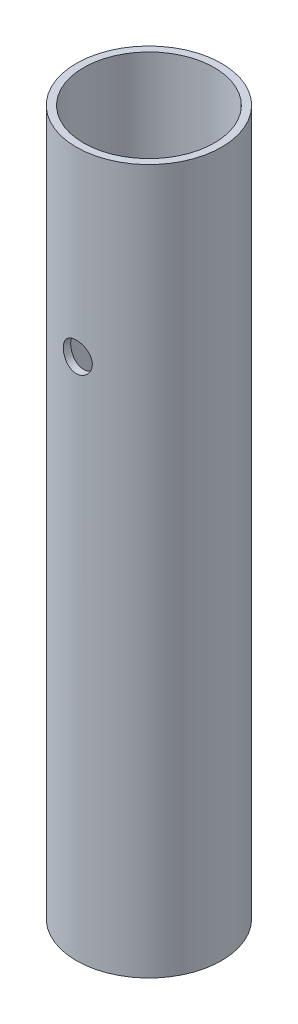
ISO-10303-21;
HEADER;
FILE_DESCRIPTION(('STEP AP214'),'2;1');
FILE_NAME('part.step','',(''),(''),'','','');
FILE_SCHEMA(('AUTOMOTIVE_DESIGN { 1 0 10303 214 1 1 1 1 }'));
ENDSEC;
DATA;
#1=APPLICATION_CONTEXT('core data for automotive mechanical design processes');
#2=APPLICATION_PROTOCOL_DEFINITION('international standard','automotive_design',2000,#1);
#3=PRODUCT_CONTEXT('',#1,'mechanical');
#4=PRODUCT('Part','Part','',(#3));
#5=PRODUCT_RELATED_PRODUCT_CATEGORY('part','',(#4));
#6=PRODUCT_DEFINITION_FORMATION('','',#4);
#7=PRODUCT_DEFINITION_CONTEXT('part definition',#1,'design');
#8=PRODUCT_DEFINITION('design','',#6,#7);
#9=PRODUCT_DEFINITION_SHAPE('','',#8);
#10=(LENGTH_UNIT() NAMED_UNIT(*) SI_UNIT(.MILLI.,.METRE.));
#11=(NAMED_UNIT(*) PLANE_ANGLE_UNIT() SI_UNIT($,.RADIAN.));
#12=(NAMED_UNIT(*) SI_UNIT($,.STERADIAN.) SOLID_ANGLE_UNIT());
#13=UNCERTAINTY_MEASURE_WITH_UNIT(LENGTH_MEASURE(1.E-05),#10,'distance_accuracy_value','');
#14=(GEOMETRIC_REPRESENTATION_CONTEXT(3) GLOBAL_UNCERTAINTY_ASSIGNED_CONTEXT((#13)) GLOBAL_UNIT_ASSIGNED_CONTEXT((#10,
#11,#12)) REPRESENTATION_CONTEXT('',''));
#15=CARTESIAN_POINT('',(0.,0.,0.));
#16=DIRECTION('',(0.,0.,1.));
#17=DIRECTION('',(1.,0.,0.));
#18=AXIS2_PLACEMENT_3D('',#15,#16,#17);
#19=CARTESIAN_POINT('',(0.,307.975,0.));
#20=DIRECTION('',(0.,1.,0.));
#21=DIRECTION('',(0.,0.,1.));
#22=AXIS2_PLACEMENT_3D('',#19,#20,#21);
#23=PLANE('',#22);
#24=CARTESIAN_POINT('',(0.,307.975,0.));
#25=DIRECTION('',(0.,1.,0.));
#26=DIRECTION('',(0.,0.,1.));
#27=AXIS2_PLACEMENT_3D('',#24,#25,#26);
#28=CIRCLE('',#27,31.75);
#29=CARTESIAN_POINT('',(0.,307.975,31.75));
#30=VERTEX_POINT('',#29);
#31=EDGE_CURVE('E10',#30,#30,#28,.T.);
#32=ORIENTED_EDGE('',*,*,#31,.T.);
#33=EDGE_LOOP('',(#32));
#34=FACE_BOUND('',#33,.T.);
#35=CARTESIAN_POINT('',(0.,307.975,0.));
#36=DIRECTION('',(0.,1.,0.));
#37=DIRECTION('',(0.,0.,1.));
#38=AXIS2_PLACEMENT_3D('',#35,#36,#37);
#39=CIRCLE('',#38,28.575);
#40=CARTESIAN_POINT('',(0.,307.975,28.575));
#41=VERTEX_POINT('',#40);
#42=EDGE_CURVE('E64',#41,#41,#39,.T.);
#43=ORIENTED_EDGE('',*,*,#42,.F.);
#44=EDGE_LOOP('',(#43));
#45=FACE_BOUND('',#44,.T.);
#46=ADVANCED_FACE('F43',(#34,#45),#23,.T.);
#47=CARTESIAN_POINT('',(0.,0.,0.));
#48=DIRECTION('',(0.,1.,0.));
#49=DIRECTION('',(0.,0.,1.));
#50=AXIS2_PLACEMENT_3D('',#47,#48,#49);
#51=PLANE('',#50);
#52=CARTESIAN_POINT('',(0.,0.,0.));
#53=DIRECTION('',(0.,1.,0.));
#54=DIRECTION('',(0.,0.,1.));
#55=AXIS2_PLACEMENT_3D('',#52,#53,#54);
#56=CIRCLE('',#55,31.75);
#57=CARTESIAN_POINT('',(0.,0.,31.75));
#58=VERTEX_POINT('',#57);
#59=EDGE_CURVE('E58',#58,#58,#56,.T.);
#60=ORIENTED_EDGE('',*,*,#59,.F.);
#61=EDGE_LOOP('',(#60));
#62=FACE_BOUND('',#61,.T.);
#63=CARTESIAN_POINT('',(0.,0.,0.));
#64=DIRECTION('',(0.,1.,0.));
#65=DIRECTION('',(0.,0.,1.));
#66=AXIS2_PLACEMENT_3D('',#63,#64,#65);
#67=CIRCLE('',#66,28.575);
#68=CARTESIAN_POINT('',(0.,0.,28.575));
#69=VERTEX_POINT('',#68);
#70=EDGE_CURVE('E67',#69,#69,#67,.T.);
#71=ORIENTED_EDGE('',*,*,#70,.T.);
#72=EDGE_LOOP('',(#71));
#73=FACE_BOUND('',#72,.T.);
#74=ADVANCED_FACE('F108',(#62,#73),#51,.F.);
#75=CARTESIAN_POINT('',(0.,307.975,0.));
#76=DIRECTION('',(0.,-1.,0.));
#77=DIRECTION('',(0.,0.,-1.));
#78=AXIS2_PLACEMENT_3D('',#75,#76,#77);
#79=CYLINDRICAL_SURFACE('',#78,31.75);
#80=CARTESIAN_POINT('',(0.,234.95,-31.75));
#81=CARTESIAN_POINT('',(-0.176515873629844,234.950003517111,-31.750001786253));
#82=CARTESIAN_POINT('',(-0.352987697070184,234.942637979714,-31.7485254277497));
#83=CARTESIAN_POINT('',(-0.704709806033701,234.913241127896,-31.7426651106269));
#84=CARTESIAN_POINT('',(-0.879959880354004,234.891207338342,-31.7382806612941));
#85=CARTESIAN_POINT('',(-1.22801018212194,234.832628425191,-31.7267212079851));
#86=CARTESIAN_POINT('',(-1.40080909558926,234.796075802001,-31.7195447618636));
#87=CARTESIAN_POINT('',(-1.74270808478486,234.708732190791,-31.7025988453969));
#88=CARTESIAN_POINT('',(-1.91180677638476,234.657935969655,-31.6928284220916));
#89=CARTESIAN_POINT('',(-2.24483065595256,234.542579240468,-31.6709811642523));
#90=CARTESIAN_POINT('',(-2.40876248514714,234.478037304188,-31.6589074439642));
#91=CARTESIAN_POINT('',(-2.73062697231968,234.335604502278,-31.6327719144705));
#92=CARTESIAN_POINT('',(-2.88855739174261,234.257708714161,-31.6187093724827));
#93=CARTESIAN_POINT('',(-3.19722223110234,234.089187104317,-31.5889902090418));
#94=CARTESIAN_POINT('',(-3.34795983411256,233.998566984883,-31.5733343025006));
#95=CARTESIAN_POINT('',(-3.64136966101498,233.805171658321,-31.5408421811988));
#96=CARTESIAN_POINT('',(-3.78403884447123,233.70239191358,-31.5240055267784));
#97=CARTESIAN_POINT('',(-4.06194074003547,233.484129433893,-31.4894105615738));
#98=CARTESIAN_POINT('',(-4.19706617045533,233.368511432613,-31.4716437358091));
#99=CARTESIAN_POINT('',(-4.45717927487416,233.126327768617,-31.435860075574));
#100=CARTESIAN_POINT('',(-4.58216317367903,232.999758065019,-31.4178431509003));
#101=CARTESIAN_POINT('',(-4.82105872090809,232.736600526564,-31.3820725979793));
#102=CARTESIAN_POINT('',(-4.93497355191153,232.600015591222,-31.3643188953019));
#103=CARTESIAN_POINT('',(-5.15103007395078,232.31766092856,-31.329560637437));
#104=CARTESIAN_POINT('',(-5.25316740714552,232.171887832149,-31.3125563609763));
#105=CARTESIAN_POINT('',(-5.44574317482543,231.870868536502,-31.2796421399617));
#106=CARTESIAN_POINT('',(-5.53607140132951,231.715550596702,-31.2637430750476));
#107=CARTESIAN_POINT('',(-5.70333527117827,231.397632781188,-31.2336627723482));
#108=CARTESIAN_POINT('',(-5.78026589012988,231.235030202192,-31.219482179631));
#109=CARTESIAN_POINT('',(-5.92007801871017,230.903790754845,-31.1932725472161));
#110=CARTESIAN_POINT('',(-5.98296581237376,230.73515662491,-31.1812425456312));
#111=CARTESIAN_POINT('',(-6.09426120308402,230.393022046669,-31.1596797091957));
#112=CARTESIAN_POINT('',(-6.1426635469331,230.219519857834,-31.1501477804351));
#113=CARTESIAN_POINT('',(-6.26436580052017,229.698175631637,-31.1259929027572));
#114=CARTESIAN_POINT('',(-6.31616350912265,229.34473348736,-31.1154218279837));
#115=CARTESIAN_POINT('',(-6.34895807298002,228.812286108104,-31.1087311881774));
#116=CARTESIAN_POINT('',(-6.35239822671563,228.634350550376,-31.1080302095165));
#117=CARTESIAN_POINT('',(-6.34436208508678,228.278808755367,-31.1096704679197));
#118=CARTESIAN_POINT('',(-6.33288556196145,228.101202523158,-31.1120117514355));
#119=CARTESIAN_POINT('',(-6.27668994676439,227.576280872722,-31.123422384838));
#120=CARTESIAN_POINT('',(-6.2105456438322,227.23111113521,-31.1368107003154));
#121=CARTESIAN_POINT('',(-6.02257965402933,226.557049849712,-31.1737072373072));
#122=CARTESIAN_POINT('',(-5.90075530818731,226.22815907995,-31.1972159421125));
#123=CARTESIAN_POINT('',(-5.60403262349579,225.593192448002,-31.2518821655055));
#124=CARTESIAN_POINT('',(-5.42878112659535,225.287285814923,-31.2830903079339));
#125=CARTESIAN_POINT('',(-5.03042913225744,224.708901252043,-31.3496081873137));
#126=CARTESIAN_POINT('',(-4.80732313575254,224.436427169713,-31.3849183954287));
#127=CARTESIAN_POINT('',(-4.31482460269526,223.927484353394,-31.4564408776495));
#128=CARTESIAN_POINT('',(-4.04467162861224,223.691751477766,-31.4926579526169));
#129=CARTESIAN_POINT('',(-3.46827489788048,223.268832792312,-31.5613318856404));
#130=CARTESIAN_POINT('',(-3.16203067844189,223.0816476051,-31.5937886954689));
#131=CARTESIAN_POINT('',(-2.52132710810059,222.761000392218,-31.6513648273005));
#132=CARTESIAN_POINT('',(-2.18682455512024,222.627622494247,-31.6764726424597));
#133=CARTESIAN_POINT('',(-1.49954599969551,222.419160970968,-31.7164344701347));
#134=CARTESIAN_POINT('',(-1.14677221636532,222.344070284073,-31.7312897247402));
#135=CARTESIAN_POINT('',(-0.439289227300463,222.25535651817,-31.7488996638347));
#136=CARTESIAN_POINT('',(-0.0847110903586681,222.24072631672,-31.751852591002));
#137=CARTESIAN_POINT('',(0.621823337614687,222.270636623481,-31.7458757969914));
#138=CARTESIAN_POINT('',(0.973779774913396,222.315173805444,-31.73694674379));
#139=CARTESIAN_POINT('',(1.66183092044862,222.461317596138,-31.7083333344831));
#140=CARTESIAN_POINT('',(1.99803979686685,222.562407451715,-31.6887464089675));
#141=CARTESIAN_POINT('',(2.64873510972006,222.818223573132,-31.6410055485747));
#142=CARTESIAN_POINT('',(2.96321991658336,222.972953857434,-31.6128509718729));
#143=CARTESIAN_POINT('',(3.56578616929235,223.333832745457,-31.5506044099281));
#144=CARTESIAN_POINT('',(3.85349724041879,223.540587642923,-31.5164439562024));
#145=CARTESIAN_POINT('',(4.39050548597875,223.998852381271,-31.4461355582368));
#146=CARTESIAN_POINT('',(4.6397985365499,224.250367020513,-31.4099874011973));
#147=CARTESIAN_POINT('',(5.0967637160485,224.795530557235,-31.339111168045));
#148=CARTESIAN_POINT('',(5.30374424342026,225.089762743337,-31.3044130988342));
#149=CARTESIAN_POINT('',(5.66539258384694,225.709609374793,-31.240994705098));
#150=CARTESIAN_POINT('',(5.82006248993914,226.035222563871,-31.2122741414201));
#151=CARTESIAN_POINT('',(6.00888128728986,226.538943791457,-31.1762701460107));
#152=CARTESIAN_POINT('',(6.06455145769408,226.709028961714,-31.1654635742738));
#153=CARTESIAN_POINT('',(6.16137084827379,227.053410302793,-31.1464680580441));
#154=CARTESIAN_POINT('',(6.20252539551952,227.227704903658,-31.1382781533681));
#155=CARTESIAN_POINT('',(6.26997942157555,227.579258617162,-31.1247656494108));
#156=CARTESIAN_POINT('',(6.2962776417427,227.756517979669,-31.1194432930729));
#157=CARTESIAN_POINT('',(6.33380495629898,228.112687683411,-31.1118270906216));
#158=CARTESIAN_POINT('',(6.34503461133419,228.291597962972,-31.1095331318328));
#159=CARTESIAN_POINT('',(6.35226474660965,228.646487038422,-31.1080575406869));
#160=CARTESIAN_POINT('',(6.34853785693816,228.822460122926,-31.1088201916633));
#161=CARTESIAN_POINT('',(6.32649775022552,229.173449644059,-31.113309893758));
#162=CARTESIAN_POINT('',(6.30818480904806,229.348466098718,-31.1170368888122));
#163=CARTESIAN_POINT('',(6.25711483230155,229.696322486522,-31.1273463511437));
#164=CARTESIAN_POINT('',(6.22435534563776,229.8691620452,-31.1339293029782));
#165=CARTESIAN_POINT('',(6.14466408954099,230.21135148816,-31.1497552236973));
#166=CARTESIAN_POINT('',(6.09773737625182,230.38070259444,-31.1589972435314));
#167=CARTESIAN_POINT('',(5.99018114767237,230.714451560489,-31.179852808307));
#168=CARTESIAN_POINT('',(5.92958046510072,230.878859029406,-31.1914613583189));
#169=CARTESIAN_POINT('',(5.79509639810806,231.201914726542,-31.2167268260793));
#170=CARTESIAN_POINT('',(5.72121771328373,231.360564968664,-31.2303830188056));
#171=CARTESIAN_POINT('',(5.56066227689416,231.67117438533,-31.2593696133703));
#172=CARTESIAN_POINT('',(5.47398021455167,231.823130749167,-31.2747007092597));
#173=CARTESIAN_POINT('',(5.28847941073908,232.119232546957,-31.3066021121074));
#174=CARTESIAN_POINT('',(5.18966483440073,232.263380637161,-31.3231719930268));
#175=CARTESIAN_POINT('',(4.97872853035759,232.545415952405,-31.3573974014845));
#176=CARTESIAN_POINT('',(4.86640554222483,232.683151015046,-31.3750667836359));
#177=CARTESIAN_POINT('',(4.63068014708206,232.948655636753,-31.4107227185785));
#178=CARTESIAN_POINT('',(4.50728164590522,233.076428679501,-31.4287091577737));
#179=CARTESIAN_POINT('',(4.25012766356565,233.321276588489,-31.464516090974));
#180=CARTESIAN_POINT('',(4.11636609340417,233.438345075658,-31.4823364804191));
#181=CARTESIAN_POINT('',(3.83949929192401,233.660857214147,-31.517300073905));
#182=CARTESIAN_POINT('',(3.69639751718187,233.766305127546,-31.5344435247363));
#183=CARTESIAN_POINT('',(3.40016257824087,233.965970908534,-31.5677659237014));
#184=CARTESIAN_POINT('',(3.24693728557459,234.060054254477,-31.5839323628997));
#185=CARTESIAN_POINT('',(2.93299471924431,234.23491940113,-31.6146312316985));
#186=CARTESIAN_POINT('',(2.77228023354734,234.315706101758,-31.629164262594));
#187=CARTESIAN_POINT('',(2.44452562453279,234.463367119417,-31.6561810934558));
#188=CARTESIAN_POINT('',(2.27748939904036,234.530249849272,-31.6686661316228));
#189=CARTESIAN_POINT('',(1.93825421946105,234.649629354515,-31.6912384274328));
#190=CARTESIAN_POINT('',(1.76605626709905,234.702128901418,-31.7013261469685));
#191=CARTESIAN_POINT('',(1.33248673917251,234.814393371527,-31.7230870847536));
#192=CARTESIAN_POINT('',(1.06865101743696,234.865176459559,-31.7331270216992));
#193=CARTESIAN_POINT('',(0.53650953612495,234.932976563711,-31.7465820167065));
#194=CARTESIAN_POINT('',(0.268203919287763,234.949994655988,-31.7499972859095));
#195=CARTESIAN_POINT('',(0.,234.95,-31.75));
#196=B_SPLINE_CURVE_WITH_KNOTS('',3,(#80,#81,#82,#83,#84,#85,#86,#87,#88,#89,#90,#91,#92,#93,
#94,#95,#96,#97,#98,#99,#100,#101,#102,#103,#104,#105,#106,#107,#108,#109,#110,#111,#112,#113,
#114,#115,#116,#117,#118,#119,#120,#121,#122,#123,#124,#125,#126,#127,#128,#129,#130,#131,#132,
#133,#134,#135,#136,#137,#138,#139,#140,#141,#142,#143,#144,#145,#146,#147,#148,#149,#150,#151,
#152,#153,#154,#155,#156,#157,#158,#159,#160,#161,#162,#163,#164,#165,#166,#167,#168,#169,#170,
#171,#172,#173,#174,#175,#176,#177,#178,#179,#180,#181,#182,#183,#184,#185,#186,#187,#188,#189,
#190,#191,#192,#193,#194,#195),.UNSPECIFIED.,.T.,.F.,(4,2,2,2,2,2,2,2,2,2,2,2,2,2,2,2,2,2,2,2,2,
2,2,2,2,2,2,2,2,2,2,2,2,2,2,2,2,2,2,2,2,2,2,2,2,2,2,2,2,2,2,2,2,2,2,2,2,4),(0.,
0.529312114039987,1.05871356728208,1.58838883517267,2.11825896195246,2.64741767457623,
3.17677186635166,3.70588958555339,4.23520538238133,4.77075073798215,5.30649454487121,
5.84208385602022,6.37787071116718,6.91834660422096,7.45902475299785,7.99946046625028,
8.54009193351099,9.60600520292841,10.1393933239035,10.672789589211,11.7225222322519,
12.772305009965,13.8291831952813,14.8861828939573,15.9621966005539,17.0382241061318,
18.1159275205837,19.1935003491785,20.253049282796,21.3125386536278,22.3625013932241,
23.4125428075706,24.4754392604714,25.5384497273197,26.617647482134,27.6968020512933,
28.2341330538773,28.7712666563531,29.3084457585129,29.8456048736531,30.3730174550141,
30.9004200617414,31.4279121854685,31.9552162745463,32.4814187198833,33.0074352873591,
33.5336706598291,34.0597258764733,34.5949149025681,35.1299159277244,35.665233721342,
36.2003545183118,36.7412917478686,37.2820291893049,37.8224384903497,38.3627435858253,
39.1670231413712,39.9712770625212),.UNSPECIFIED.);
#197=CARTESIAN_POINT('',(0.,234.95,-31.75));
#198=VERTEX_POINT('',#197);
#199=EDGE_CURVE('E94',#198,#198,#196,.T.);
#200=ORIENTED_EDGE('',*,*,#199,.T.);
#201=EDGE_LOOP('',(#200));
#202=FACE_BOUND('',#201,.T.);
#203=CARTESIAN_POINT('',(6.35,228.6,31.1085197333464));
#204=CARTESIAN_POINT('',(6.35000352965397,228.42352383559,31.1085178108911));
#205=CARTESIAN_POINT('',(6.34264126953907,228.247091736493,31.110024226625));
#206=CARTESIAN_POINT('',(6.31325784324557,227.895450159614,31.1160010172917));
#207=CARTESIAN_POINT('',(6.29123419873982,227.720240893598,31.1204718933298));
#208=CARTESIAN_POINT('',(6.23268302188221,227.372273052546,31.1322509181554));
#209=CARTESIAN_POINT('',(6.19614792837602,227.199515803809,31.1395605460233));
#210=CARTESIAN_POINT('',(6.10884756830871,226.85770106187,31.1568044027474));
#211=CARTESIAN_POINT('',(6.05807706364932,226.688644955281,31.1667395976364));
#212=CARTESIAN_POINT('',(5.94278242475048,226.355711701628,31.1889287217452));
#213=CARTESIAN_POINT('',(5.87827737527494,226.191827726813,31.2011794308286));
#214=CARTESIAN_POINT('',(5.73592730042869,225.870054937498,31.2276620589226));
#215=CARTESIAN_POINT('',(5.65807735407483,225.712168360893,31.2418947084169));
#216=CARTESIAN_POINT('',(5.48965449210837,225.403583559738,31.2719283606296));
#217=CARTESIAN_POINT('',(5.39908723222125,225.252882179436,31.2877286652587));
#218=CARTESIAN_POINT('',(5.20580256304731,224.959535088672,31.3204681817267));
#219=CARTESIAN_POINT('',(5.10308061702835,224.816892415656,31.337407817796));
#220=CARTESIAN_POINT('',(4.88487647886519,224.538955767765,31.3721665291629));
#221=CARTESIAN_POINT('',(4.7692526430892,224.403774010068,31.3899938693132));
#222=CARTESIAN_POINT('',(4.52704538325729,224.143547617887,31.4258388721703));
#223=CARTESIAN_POINT('',(4.40045791318251,224.018506759046,31.4438566029667));
#224=CARTESIAN_POINT('',(4.1372534632526,223.779499598338,31.4795689594845));
#225=CARTESIAN_POINT('',(4.00063945933364,223.665530033593,31.4972636791461));
#226=CARTESIAN_POINT('',(3.71821533757456,223.449368051746,31.5318508682276));
#227=CARTESIAN_POINT('',(3.57240184945219,223.347179990084,31.5487430396095));
#228=CARTESIAN_POINT('',(3.27134927808729,223.154545725515,31.5813850448061));
#229=CARTESIAN_POINT('',(3.1160415103462,223.064204975405,31.5971241323102));
#230=CARTESIAN_POINT('',(2.79814283643944,222.89691503045,31.6268620084164));
#231=CARTESIAN_POINT('',(2.63554922691931,222.819970858908,31.6408601436557));
#232=CARTESIAN_POINT('',(2.30432798182607,222.680131141841,31.6667034900586));
#233=CARTESIAN_POINT('',(2.13570305797417,222.617229372627,31.6785496545553));
#234=CARTESIAN_POINT('',(1.79358912840508,222.505905844958,31.6997641681565));
#235=CARTESIAN_POINT('',(1.62009838125299,222.457489344888,31.7091316173057));
#236=CARTESIAN_POINT('',(1.09881790139745,222.335749209317,31.7328561059012));
#237=CARTESIAN_POINT('',(0.745434289901047,222.283922207883,31.7432198335018));
#238=CARTESIAN_POINT('',(0.213073296878946,222.251069094988,31.7497873225853));
#239=CARTESIAN_POINT('',(0.035165964123797,222.247607014947,31.7504785894235));
#240=CARTESIAN_POINT('',(-0.320322123483623,222.255594728642,31.7488811393463));
#241=CARTESIAN_POINT('',(-0.497902873110932,222.267044758912,31.746592375162));
#242=CARTESIAN_POINT('',(-1.02305381244427,222.323187755784,31.7354178724373));
#243=CARTESIAN_POINT('',(-1.3684812734637,222.389349670036,31.7222872253983));
#244=CARTESIAN_POINT('',(-2.04304886823863,222.577438891131,31.6860045205057));
#245=CARTESIAN_POINT('',(-2.37218834973945,222.699368429198,31.6628520616883));
#246=CARTESIAN_POINT('',(-3.00746924755296,222.996315502072,31.6088579535731));
#247=CARTESIAN_POINT('',(-3.31345265993525,223.171662751717,31.5779687669697));
#248=CARTESIAN_POINT('',(-3.89195088746714,223.570222708259,31.511904903753));
#249=CARTESIAN_POINT('',(-4.16446184582488,223.793440922866,31.476729734225));
#250=CARTESIAN_POINT('',(-4.6732905302415,224.286023481747,31.4052562117905));
#251=CARTESIAN_POINT('',(-4.90889462711121,224.556124330706,31.3689489681662));
#252=CARTESIAN_POINT('',(-5.33157771480941,225.132369414589,31.2998848034075));
#253=CARTESIAN_POINT('',(-5.51865578784077,225.438514331074,31.2671279494303));
#254=CARTESIAN_POINT('',(-5.83922379826299,226.079182280604,31.2088560123341));
#255=CARTESIAN_POINT('',(-5.97259819449291,226.413764643687,31.1833565774064));
#256=CARTESIAN_POINT('',(-6.18102868817351,227.101217906344,31.1427162458207));
#257=CARTESIAN_POINT('',(-6.25609238629833,227.454086415958,31.1275739991561));
#258=CARTESIAN_POINT('',(-6.34470413857638,228.161626846748,31.1096329331129));
#259=CARTESIAN_POINT('',(-6.35928282318092,228.516164591404,31.1066273360059));
#260=CARTESIAN_POINT('',(-6.32928392059337,229.222606222812,31.1127448401072));
#261=CARTESIAN_POINT('',(-6.28470968786131,229.57451025778,31.1218672535569));
#262=CARTESIAN_POINT('',(-6.13855909700573,230.262230845667,31.1510192618596));
#263=CARTESIAN_POINT('',(-6.03753342500046,230.598169303318,31.1709434300677));
#264=CARTESIAN_POINT('',(-5.78193529151485,231.248351896797,31.2193615811841));
#265=CARTESIAN_POINT('',(-5.62735841899352,231.562594242947,31.2478562700252));
#266=CARTESIAN_POINT('',(-5.26671737189738,232.164972964857,31.3106692503795));
#267=CARTESIAN_POINT('',(-5.06000835825492,232.452715680252,31.3450586073921));
#268=CARTESIAN_POINT('',(-4.60181287007307,232.989808845073,31.4155915690316));
#269=CARTESIAN_POINT('',(-4.35032178697911,233.239155338188,31.451735353929));
#270=CARTESIAN_POINT('',(-3.80514015244604,233.696268217544,31.5223740606501));
#271=CARTESIAN_POINT('',(-3.51086106064981,233.903337546841,31.5568351532982));
#272=CARTESIAN_POINT('',(-2.89089395358626,234.265141507072,31.6196441155571));
#273=CARTESIAN_POINT('',(-2.5652072580855,234.41987833582,31.6479922418764));
#274=CARTESIAN_POINT('',(-2.06145931814501,234.608741663909,31.6834545251939));
#275=CARTESIAN_POINT('',(-1.89142419678391,234.664408664306,31.6940818842471));
#276=CARTESIAN_POINT('',(-1.54714780275177,234.761229259573,31.7127491568066));
#277=CARTESIAN_POINT('',(-1.37290809541261,234.802388169265,31.720790017743));
#278=CARTESIAN_POINT('',(-1.02146662350878,234.869859812117,31.7340519544925));
#279=CARTESIAN_POINT('',(-0.844264584786209,234.896171163245,31.7392727678096));
#280=CARTESIAN_POINT('',(-0.48821090793864,234.933734183265,31.7467454492913));
#281=CARTESIAN_POINT('',(-0.309359330073799,234.944986400113,31.7489974254827));
#282=CARTESIAN_POINT('',(0.0455478764120614,234.952273663548,31.7504546434394));
#283=CARTESIAN_POINT('',(0.221597991326798,234.948570143226,31.7497122287987));
#284=CARTESIAN_POINT('',(0.572744112386659,234.926563805665,31.7453192352643));
#285=CARTESIAN_POINT('',(0.747840136517743,234.908261264604,31.7416687113849));
#286=CARTESIAN_POINT('',(1.09585752140951,234.857198494089,31.7315601252889));
#287=CARTESIAN_POINT('',(1.26877851579409,234.824435861558,31.7251015964213));
#288=CARTESIAN_POINT('',(1.61113197945253,234.744723994435,31.7095586102968));
#289=CARTESIAN_POINT('',(1.78056567274322,234.697779831389,31.7004750918291));
#290=CARTESIAN_POINT('',(2.11450386521707,234.59016595803,31.6799511720231));
#291=CARTESIAN_POINT('',(2.27901728275358,234.529523030463,31.6685153735272));
#292=CARTESIAN_POINT('',(2.60227862901699,234.394936454954,31.6435920801276));
#293=CARTESIAN_POINT('',(2.76102857721267,234.320997520944,31.63010531263));
#294=CARTESIAN_POINT('',(3.07182664827637,234.160305591911,31.6014358670824));
#295=CARTESIAN_POINT('',(3.22387198234193,234.073547328731,31.5862524924329));
#296=CARTESIAN_POINT('',(3.52013767812032,233.887880722534,31.5546085541198));
#297=CARTESIAN_POINT('',(3.66436070621944,233.788976557688,31.5381484303699));
#298=CARTESIAN_POINT('',(3.94640998656119,233.577939284948,31.5041086276047));
#299=CARTESIAN_POINT('',(4.0840913833523,233.465614786915,31.4865149549271));
#300=CARTESIAN_POINT('',(4.34948710126135,233.229897518759,31.4509520575298));
#301=CARTESIAN_POINT('',(4.4772049066996,233.106508650644,31.4329829669079));
#302=CARTESIAN_POINT('',(4.72194312383746,232.849385108589,31.3971505322712));
#303=CARTESIAN_POINT('',(4.83895709176201,232.715644290984,31.3792872579311));
#304=CARTESIAN_POINT('',(5.06136278678991,232.438830318081,31.3441825624069));
#305=CARTESIAN_POINT('',(5.16675876618455,232.295760607963,31.3269409152667));
#306=CARTESIAN_POINT('',(5.36635585799919,231.999554762855,31.2933712660395));
#307=CARTESIAN_POINT('',(5.46041869766267,231.846323998045,31.2770556278699));
#308=CARTESIAN_POINT('',(5.63524258374716,231.53237333481,31.2460305142114));
#309=CARTESIAN_POINT('',(5.71600853022447,231.371656223325,31.2313204477275));
#310=CARTESIAN_POINT('',(5.86362866048357,231.043897683308,31.2039420449014));
#311=CARTESIAN_POINT('',(5.93049132287948,230.876860183028,31.191272465282));
#312=CARTESIAN_POINT('',(6.04983198149677,230.537621222421,31.1683447042479));
#313=CARTESIAN_POINT('',(6.10231276076966,230.365420768347,31.1580860563464));
#314=CARTESIAN_POINT('',(6.2145026469957,229.931953535648,31.1359475624671));
#315=CARTESIAN_POINT('',(6.26524447776627,229.66822500119,31.1257189811481));
#316=CARTESIAN_POINT('',(6.33298989163512,229.136296975648,31.1120066431205));
#317=CARTESIAN_POINT('',(6.34999463784868,228.868097639021,31.1085226538864));
#318=CARTESIAN_POINT('',(6.35,228.6,31.1085197333464));
#319=B_SPLINE_CURVE_WITH_KNOTS('',3,(#203,#204,#205,#206,#207,#208,#209,#210,#211,#212,#213,
#214,#215,#216,#217,#218,#219,#220,#221,#222,#223,#224,#225,#226,#227,#228,#229,#230,#231,#232,
#233,#234,#235,#236,#237,#238,#239,#240,#241,#242,#243,#244,#245,#246,#247,#248,#249,#250,#251,
#252,#253,#254,#255,#256,#257,#258,#259,#260,#261,#262,#263,#264,#265,#266,#267,#268,#269,#270,
#271,#272,#273,#274,#275,#276,#277,#278,#279,#280,#281,#282,#283,#284,#285,#286,#287,#288,#289,
#290,#291,#292,#293,#294,#295,#296,#297,#298,#299,#300,#301,#302,#303,#304,#305,#306,#307,#308,
#309,#310,#311,#312,#313,#314,#315,#316,#317,#318),.UNSPECIFIED.,.T.,.F.,(4,2,2,2,2,2,2,2,2,2,2,
2,2,2,2,2,2,2,2,2,2,2,2,2,2,2,2,2,2,2,2,2,2,2,2,2,2,2,2,2,2,2,2,2,2,2,2,2,2,2,2,2,2,2,2,2,2,4),
(0.,0.529192824017304,1.05847512431125,1.58803356836858,2.11778712640188,2.64680931691147,
3.17602700774436,3.70501008253467,4.23419122660465,4.76989337143009,5.30579406105337,
5.84153633037384,6.37747602457235,6.91790211014691,7.45853040439669,7.99891861063168,
8.53950274902681,9.60524741944587,10.1385532375566,10.6718675149982,11.722333887346,
12.7728422917995,13.8299709337326,14.8872212670156,15.9628992650341,17.0385976064091,
18.1165980571035,19.1944579691676,20.2538743662693,21.3132306882596,22.3624289489456,
23.4117136532091,24.4746750413869,25.5377458829631,26.6171359557789,27.6964806917164,
28.2336350375249,28.7705923999337,29.307599734856,29.8445875291854,30.3722295246526,
30.8998615386703,31.4275812712333,31.9551125056042,32.4816211446926,33.0079434834282,
33.5344827211633,34.0608413348825,34.5958869383104,35.1307445868251,35.6659221325256,
36.2009031433033,36.7418628907065,37.2826228399026,37.82305204501,38.3633765971959,
39.1673392099915,39.9712741049963),.UNSPECIFIED.);
#320=CARTESIAN_POINT('',(6.35,228.6,31.1085197333464));
#321=VERTEX_POINT('',#320);
#322=EDGE_CURVE('E88',#321,#321,#319,.T.);
#323=ORIENTED_EDGE('',*,*,#322,.T.);
#324=EDGE_LOOP('',(#323));
#325=FACE_BOUND('',#324,.T.);
#326=ORIENTED_EDGE('',*,*,#31,.F.);
#327=EDGE_LOOP('',(#326));
#328=FACE_BOUND('',#327,.T.);
#329=ORIENTED_EDGE('',*,*,#59,.T.);
#330=EDGE_LOOP('',(#329));
#331=FACE_BOUND('',#330,.T.);
#332=ADVANCED_FACE('F45',(#202,#325,#328,#331),#79,.T.);
#333=CARTESIAN_POINT('',(0.,307.975,0.));
#334=DIRECTION('',(0.,-1.,0.));
#335=DIRECTION('',(0.,0.,-1.));
#336=AXIS2_PLACEMENT_3D('',#333,#334,#335);
#337=CYLINDRICAL_SURFACE('',#336,28.575);
#338=CARTESIAN_POINT('',(0.,234.95,-28.575));
#339=CARTESIAN_POINT('',(-0.17608075683089,234.950004190615,-28.5750023177897));
#340=CARTESIAN_POINT('',(-0.352111959329941,234.942674548688,-28.5733698154246));
#341=CARTESIAN_POINT('',(-0.702949902107823,234.913424552644,-28.5668904609931));
#342=CARTESIAN_POINT('',(-0.877756459700864,234.891502066586,-28.5620431392581));
#343=CARTESIAN_POINT('',(-1.22490189168866,234.833226587992,-28.5492633411928));
#344=CARTESIAN_POINT('',(-1.39723967195969,234.796867390548,-28.5413295383205));
#345=CARTESIAN_POINT('',(-1.73821889338372,234.709996531166,-28.5225942628684));
#346=CARTESIAN_POINT('',(-1.90685894969674,234.659479661434,-28.511791735126));
#347=CARTESIAN_POINT('',(-2.23895843332378,234.544777845256,-28.4876354398165));
#348=CARTESIAN_POINT('',(-2.40242501751542,234.480612822355,-28.4742853940014));
#349=CARTESIAN_POINT('',(-2.72338248806108,234.339029918291,-28.44538253741));
#350=CARTESIAN_POINT('',(-2.88087114346871,234.261607147642,-28.429828914316));
#351=CARTESIAN_POINT('',(-3.18869794608311,234.094123714655,-28.3969502577703));
#352=CARTESIAN_POINT('',(-3.33903900302908,234.004068255016,-28.379625954356));
#353=CARTESIAN_POINT('',(-3.63171336092112,233.811891969355,-28.3436594889908));
#354=CARTESIAN_POINT('',(-3.7740436340631,233.709766625938,-28.325016834676));
#355=CARTESIAN_POINT('',(-4.05171206227023,233.492610799793,-28.2866432003194));
#356=CARTESIAN_POINT('',(-4.18691939333632,233.377415100015,-28.2669003831913));
#357=CARTESIAN_POINT('',(-4.44723854512788,233.136086749368,-28.2271153768936));
#358=CARTESIAN_POINT('',(-4.5723466040724,233.009950059155,-28.2070730794375));
#359=CARTESIAN_POINT('',(-4.81154459817089,232.74765392252,-28.1672569472086));
#360=CARTESIAN_POINT('',(-4.92563755112827,232.611497239387,-28.1474830401881));
#361=CARTESIAN_POINT('',(-5.14210895766052,232.329980671173,-28.1087431062667));
#362=CARTESIAN_POINT('',(-5.24448307391178,232.184617409313,-28.0897773801059));
#363=CARTESIAN_POINT('',(-5.43782160905091,231.884033875367,-28.0529947990893));
#364=CARTESIAN_POINT('',(-5.52864669307403,231.728722064964,-28.0351930419296));
#365=CARTESIAN_POINT('',(-5.69689851043545,231.410733709318,-28.0014881132573));
#366=CARTESIAN_POINT('',(-5.77432020031641,231.248054420747,-27.9855856571126));
#367=CARTESIAN_POINT('',(-5.9150948019203,230.916578187889,-27.9561704566485));
#368=CARTESIAN_POINT('',(-5.9784542860527,230.747784144617,-27.9426565965484));
#369=CARTESIAN_POINT('',(-6.09066102034614,230.405247069546,-27.9184117398743));
#370=CARTESIAN_POINT('',(-6.13950303305995,230.231502276385,-27.9076817478094));
#371=CARTESIAN_POINT('',(-6.26219960133742,229.710352500445,-27.8805103371779));
#372=CARTESIAN_POINT('',(-6.31465720874924,229.357280366843,-27.8685605058405));
#373=CARTESIAN_POINT('',(-6.34850719518253,228.825272880788,-27.8608509439535));
#374=CARTESIAN_POINT('',(-6.35231039450631,228.647466222556,-27.8599853053278));
#375=CARTESIAN_POINT('',(-6.34502009864616,228.2921526203,-27.8616469244474));
#376=CARTESIAN_POINT('',(-6.33392640827111,228.114645680232,-27.8641742266499));
#377=CARTESIAN_POINT('',(-6.27903572185927,227.591320847208,-27.8766216239919));
#378=CARTESIAN_POINT('',(-6.21406190277786,227.247599550441,-27.8913108849663));
#379=CARTESIAN_POINT('',(-6.02895892287586,226.57624270968,-27.9319006048894));
#380=CARTESIAN_POINT('',(-5.90882657837562,226.248608095398,-27.9578017109666));
#381=CARTESIAN_POINT('',(-5.61580279167864,225.615389185692,-28.0181343500434));
#382=CARTESIAN_POINT('',(-5.44248723802016,225.310007497948,-28.0526340214589));
#383=CARTESIAN_POINT('',(-5.04831561570782,224.732265523329,-28.126237055699));
#384=CARTESIAN_POINT('',(-4.82745286943003,224.459909883106,-28.1653410648164));
#385=CARTESIAN_POINT('',(-4.33859572078673,223.949549011796,-28.2448182779834));
#386=CARTESIAN_POINT('',(-4.0696585052898,223.712447243644,-28.2852003184625));
#387=CARTESIAN_POINT('',(-3.49537850887135,223.286561874361,-28.3618888830109));
#388=CARTESIAN_POINT('',(-3.19003502677279,223.097779204066,-28.398195328559));
#389=CARTESIAN_POINT('',(-2.55048763164605,222.773655126007,-28.4627657918811));
#390=CARTESIAN_POINT('',(-2.21622023903772,222.63843509341,-28.4910115036968));
#391=CARTESIAN_POINT('',(-1.52894008019406,222.426336264456,-28.5361423289251));
#392=CARTESIAN_POINT('',(-1.17593013823381,222.349448704648,-28.5530291487726));
#393=CARTESIAN_POINT('',(-0.468933161008551,222.257518357682,-28.5732955892763));
#394=CARTESIAN_POINT('',(-0.115114067144983,222.241241742751,-28.5769446444414));
#395=CARTESIAN_POINT('',(0.590187814128713,222.267647000261,-28.5710807364728));
#396=CARTESIAN_POINT('',(0.941670763645108,222.310324737992,-28.5615686963807));
#397=CARTESIAN_POINT('',(1.62821382122408,222.452404317327,-28.5306217179502));
#398=CARTESIAN_POINT('',(1.96341513401107,222.551156265706,-28.5093234512315));
#399=CARTESIAN_POINT('',(2.6124942357846,222.801858740466,-28.4571891107699));
#400=CARTESIAN_POINT('',(2.92637016551459,222.953813898287,-28.4263522066976));
#401=CARTESIAN_POINT('',(3.52896915446124,223.30915631285,-28.3578983980354));
#402=CARTESIAN_POINT('',(3.81725609748456,223.513264794881,-28.3201887399471));
#403=CARTESIAN_POINT('',(4.3559327118927,223.966190740602,-28.2423561528598));
#404=CARTESIAN_POINT('',(4.6063172832408,224.215014211181,-28.2022329001076));
#405=CARTESIAN_POINT('',(5.06696397665686,224.755910691468,-28.1231623792335));
#406=CARTESIAN_POINT('',(5.27637014396891,225.048717820824,-28.0842521156764));
#407=CARTESIAN_POINT('',(5.64308966048819,225.666268871681,-28.0128770235037));
#408=CARTESIAN_POINT('',(5.80040528602783,225.991011396815,-27.9804119132629));
#409=CARTESIAN_POINT('',(5.99321567474906,226.493814690275,-27.9395092546125));
#410=CARTESIAN_POINT('',(6.05020818457126,226.663612964191,-27.9271940910514));
#411=CARTESIAN_POINT('',(6.14968773030059,227.007571411732,-27.9054580011553));
#412=CARTESIAN_POINT('',(6.19218016025316,227.181729937403,-27.896035998692));
#413=CARTESIAN_POINT('',(6.26230483541742,227.533153668002,-27.8803775064103));
#414=CARTESIAN_POINT('',(6.28993622620103,227.710419050954,-27.8741411997529));
#415=CARTESIAN_POINT('',(6.33010781547874,228.066735775923,-27.8650459883301));
#416=CARTESIAN_POINT('',(6.3426486340232,228.245787044257,-27.8621869447978));
#417=CARTESIAN_POINT('',(6.35241930656275,228.600283324163,-27.8599608072711));
#418=CARTESIAN_POINT('',(6.34998800597695,228.775718620866,-27.8605164327213));
#419=CARTESIAN_POINT('',(6.33062522626174,229.125742749725,-27.864922534279));
#420=CARTESIAN_POINT('',(6.3136940421059,229.300331599027,-27.8687729433601));
#421=CARTESIAN_POINT('',(6.26546696159863,229.647440824366,-27.879654912879));
#422=CARTESIAN_POINT('',(6.23416872401064,229.819960858567,-27.886686991795));
#423=CARTESIAN_POINT('',(6.15747344142577,230.161622224388,-27.9037217219813));
#424=CARTESIAN_POINT('',(6.11208139735697,230.330764731838,-27.9137233195175));
#425=CARTESIAN_POINT('',(6.00772847370089,230.663996002763,-27.936368074719));
#426=CARTESIAN_POINT('',(5.94881396503861,230.828099912633,-27.9490021916629));
#427=CARTESIAN_POINT('',(5.81779947525465,231.150687396922,-27.976567167553));
#428=CARTESIAN_POINT('',(5.74570411885851,231.309172919435,-27.9914972206398));
#429=CARTESIAN_POINT('',(5.58880313926041,231.619609256722,-28.0232458863871));
#430=CARTESIAN_POINT('',(5.50399204302804,231.771557221218,-28.0400653114738));
#431=CARTESIAN_POINT('',(5.32230633380696,232.067814997478,-28.075117691534));
#432=CARTESIAN_POINT('',(5.22543578385087,232.212127358579,-28.0933501696489));
#433=CARTESIAN_POINT('',(5.01808184287268,232.495226380289,-28.1311360561748));
#434=CARTESIAN_POINT('',(4.90735325734738,232.633830865019,-28.1507092819565));
#435=CARTESIAN_POINT('',(4.6747671664071,232.901213717214,-28.1902657556729));
#436=CARTESIAN_POINT('',(4.55291353146239,233.029995473661,-28.2102488591469));
#437=CARTESIAN_POINT('',(4.29878158574029,233.277006972935,-28.2500911465105));
#438=CARTESIAN_POINT('',(4.16649716131002,233.395230439506,-28.2699502502524));
#439=CARTESIAN_POINT('',(3.89249224249308,233.6202007682,-28.3089785995894));
#440=CARTESIAN_POINT('',(3.75077522523535,233.726951821862,-28.3281480954238));
#441=CARTESIAN_POINT('',(3.45676558355462,233.929690158335,-28.365536380832));
#442=CARTESIAN_POINT('',(3.30435335350721,234.025507228679,-28.3837382550184));
#443=CARTESIAN_POINT('',(2.99185131527484,234.203899227309,-28.4183770821156));
#444=CARTESIAN_POINT('',(2.83176436336086,234.28647903311,-28.4348146843641));
#445=CARTESIAN_POINT('',(2.5050556732126,234.437771568015,-28.4654564229044));
#446=CARTESIAN_POINT('',(2.3384374804157,234.506491699571,-28.4796617505541));
#447=CARTESIAN_POINT('',(1.99983671699835,234.629561960736,-28.505440486581));
#448=CARTESIAN_POINT('',(1.82785509362795,234.683914611935,-28.5170143567472));
#449=CARTESIAN_POINT('',(1.38486854748048,234.803395287395,-28.5426893406202));
#450=CARTESIAN_POINT('',(1.11091108091003,234.858288914216,-28.5547377993202));
#451=CARTESIAN_POINT('',(0.557927474970583,234.931587092934,-28.5708911064425));
#452=CARTESIAN_POINT('',(0.278901574799597,234.949993362312,-28.5749963287574));
#453=CARTESIAN_POINT('',(0.,234.95,-28.575));
#454=B_SPLINE_CURVE_WITH_KNOTS('',3,(#338,#339,#340,#341,#342,#343,#344,#345,#346,#347,#348,
#349,#350,#351,#352,#353,#354,#355,#356,#357,#358,#359,#360,#361,#362,#363,#364,#365,#366,#367,
#368,#369,#370,#371,#372,#373,#374,#375,#376,#377,#378,#379,#380,#381,#382,#383,#384,#385,#386,
#387,#388,#389,#390,#391,#392,#393,#394,#395,#396,#397,#398,#399,#400,#401,#402,#403,#404,#405,
#406,#407,#408,#409,#410,#411,#412,#413,#414,#415,#416,#417,#418,#419,#420,#421,#422,#423,#424,
#425,#426,#427,#428,#429,#430,#431,#432,#433,#434,#435,#436,#437,#438,#439,#440,#441,#442,#443,
#444,#445,#446,#447,#448,#449,#450,#451,#452,#453),.UNSPECIFIED.,.T.,.F.,(4,2,2,2,2,2,2,2,2,2,2,
2,2,2,2,2,2,2,2,2,2,2,2,2,2,2,2,2,2,2,2,2,2,2,2,2,2,2,2,2,2,2,2,2,2,2,2,2,2,2,2,2,2,2,2,2,2,4),
(0.,0.527997017179435,1.05607118897308,1.58437257349354,2.11286854544606,2.6405982510398,
3.16852300538264,3.69623097187213,4.22413707279081,4.75967469542971,5.29541088363771,
5.83099987744677,6.36678646447937,6.90852316887423,7.45046327811566,7.9921495588737,
8.5340310264728,9.59922812619048,10.1322493620483,10.6652775820506,11.7102745284294,
12.7553317982812,13.8089495780951,14.8627154267669,15.9400257737509,17.0173568728579,
18.0971154715727,19.176711823004,20.2342073147614,21.2916286437804,22.3370376690649,
23.3825377218342,24.4433623183857,25.5043295298771,26.5855243359228,27.6666718880214,
28.2047199860614,28.7425677108684,29.2804463556588,29.8183028990183,30.344032228855,
30.8697508639456,31.3955551998986,31.9211731766572,32.4450149554279,32.9686732868749,
33.492557658615,34.0162660001854,34.5510846605381,35.0857179582492,35.6206669762146,
36.1554198769742,36.697604701193,37.2395892857687,37.7812836252553,38.3228828304708,
39.1592384567028,39.9955547142611),.UNSPECIFIED.);
#455=CARTESIAN_POINT('',(0.,234.95,-28.575));
#456=VERTEX_POINT('',#455);
#457=EDGE_CURVE('E48',#456,#456,#454,.T.);
#458=ORIENTED_EDGE('',*,*,#457,.F.);
#459=EDGE_LOOP('',(#458));
#460=FACE_BOUND('',#459,.T.);
#461=CARTESIAN_POINT('',(6.35,228.6,27.86051192997));
#462=CARTESIAN_POINT('',(6.35000421396891,228.423979625313,27.8605093913621));
#463=CARTESIAN_POINT('',(6.34267954016508,228.24800883849,27.8621830311309));
#464=CARTESIAN_POINT('',(6.31344990728655,227.897293383222,27.8688216917255));
#465=CARTESIAN_POINT('',(6.29154281182279,227.722548898227,27.8737871948232));
#466=CARTESIAN_POINT('',(6.23330939741874,227.375528850572,27.8868671873619));
#467=CARTESIAN_POINT('',(6.1969767746532,227.203254401442,27.8949830534483));
#468=CARTESIAN_POINT('',(6.11017147859357,226.862403263199,27.914125538938));
#469=CARTESIAN_POINT('',(6.059693589925,226.693827962734,27.9251532318482));
#470=CARTESIAN_POINT('',(5.94508588279244,226.36186632019,27.9497764757684));
#471=CARTESIAN_POINT('',(5.88097676315887,226.198472537553,27.9633681299492));
#472=CARTESIAN_POINT('',(5.73951923732853,225.877654639362,27.9927447863739));
#473=CARTESIAN_POINT('',(5.66216594394067,225.720232753767,28.0085305978709));
#474=CARTESIAN_POINT('',(5.49483220350207,225.412527977617,28.0418386458745));
#475=CARTESIAN_POINT('',(5.40485689036567,225.262242217596,28.0593601755432));
#476=CARTESIAN_POINT('',(5.21284843148356,224.969663803178,28.0956648329011));
#477=CARTESIAN_POINT('',(5.11081076972037,224.82737417205,28.1144484319526));
#478=CARTESIAN_POINT('',(4.89374382733096,224.549653601224,28.153050090638));
#479=CARTESIAN_POINT('',(4.7785396482872,224.414360922452,28.1728795810551));
#480=CARTESIAN_POINT('',(4.53717626468557,224.153870021696,28.2127563294273));
#481=CARTESIAN_POINT('',(4.41101301297986,224.02867556215,28.2328036654203));
#482=CARTESIAN_POINT('',(4.14864644355519,223.789308130515,28.2725476743946));
#483=CARTESIAN_POINT('',(4.01244600513601,223.675132019206,28.2922444459426));
#484=CARTESIAN_POINT('',(3.7308246316413,223.458500222239,28.3307567094834));
#485=CARTESIAN_POINT('',(3.58540031798819,223.356048870182,28.3495718741168));
#486=CARTESIAN_POINT('',(3.28476560058805,223.16262051617,28.3859841959954));
#487=CARTESIAN_POINT('',(3.12946826082928,223.07177572591,28.4035664381961));
#488=CARTESIAN_POINT('',(2.81150681185804,222.903483065654,28.4368005134375));
#489=CARTESIAN_POINT('',(2.64883995915664,222.826040237457,28.4524516193547));
#490=CARTESIAN_POINT('',(2.31738888118642,222.685222827445,28.4813614549779));
#491=CARTESIAN_POINT('',(2.14860751618563,222.621841764144,28.4946212863637));
#492=CARTESIAN_POINT('',(1.80609916717115,222.509591829369,28.5183842048799));
#493=CARTESIAN_POINT('',(1.63237042032478,222.460728203427,28.5288862954074));
#494=CARTESIAN_POINT('',(1.11131864681694,222.337975547475,28.5554612433503));
#495=CARTESIAN_POINT('',(0.758338241916749,222.285474537744,28.5671227611531));
#496=CARTESIAN_POINT('',(0.226466560370625,222.251536527423,28.5746596759603));
#497=CARTESIAN_POINT('',(0.0487043561103882,222.247700204616,28.5755111030236));
#498=CARTESIAN_POINT('',(-0.306524454655841,222.254917041601,28.5739073436746));
#499=CARTESIAN_POINT('',(-0.483991056983243,222.265970410112,28.5714521109103));
#500=CARTESIAN_POINT('',(-1.00766104258892,222.320779996174,28.5593275409746));
#501=CARTESIAN_POINT('',(-1.35177234501589,222.385779071558,28.5449878048759));
#502=CARTESIAN_POINT('',(-2.02389600727295,222.571065159076,28.5052301019876));
#503=CARTESIAN_POINT('',(-2.35190762321505,222.691354723256,28.4798116238385));
#504=CARTESIAN_POINT('',(-2.98560883971441,222.984716955951,28.4203942085424));
#505=CARTESIAN_POINT('',(-3.29111231076475,223.158179224929,28.3863322683757));
#506=CARTESIAN_POINT('',(-3.86903706464475,223.552671098394,28.3133569811578));
#507=CARTESIAN_POINT('',(-4.14145369720248,223.773707377214,28.2744429537118));
#508=CARTESIAN_POINT('',(-4.65164377611461,224.262696601625,28.1950529827219));
#509=CARTESIAN_POINT('',(-4.88854790814641,224.531554919959,28.154561442571));
#510=CARTESIAN_POINT('',(-5.31407090642613,225.105603727432,28.0773607136919));
#511=CARTESIAN_POINT('',(-5.5026883770704,225.410795266317,28.0406516343045));
#512=CARTESIAN_POINT('',(-5.82668899135032,226.050284144376,27.9751292631342));
#513=CARTESIAN_POINT('',(-5.96190313964781,226.384669856633,27.9463411230536));
#514=CARTESIAN_POINT('',(-6.17395482637264,227.072209594416,27.9002653216252));
#515=CARTESIAN_POINT('',(-6.25080195615806,227.425360526073,27.882975770791));
#516=CARTESIAN_POINT('',(-6.3425799903313,228.132449457352,27.8622413441994));
#517=CARTESIAN_POINT('',(-6.35877885508508,228.486214760428,27.8585129952536));
#518=CARTESIAN_POINT('',(-6.33223736151478,229.191391136066,27.8645576971504));
#519=CARTESIAN_POINT('',(-6.28950119337941,229.542802374213,27.8743297881329));
#520=CARTESIAN_POINT('',(-6.14740451063314,230.228849710794,27.9060061709084));
#521=CARTESIAN_POINT('',(-6.0487465237268,230.563638919594,27.9277598477335));
#522=CARTESIAN_POINT('',(-5.79836807867824,231.211934880813,27.9808117288197));
#523=CARTESIAN_POINT('',(-5.64664240768494,231.525439538832,28.0121108706953));
#524=CARTESIAN_POINT('',(-5.29166149677445,232.127740943918,28.0813469674026));
#525=CARTESIAN_POINT('',(-5.08762765329584,232.416067328379,28.1193812657169));
#526=CARTESIAN_POINT('',(-4.6348198419645,232.954857631612,28.1975479359144));
#527=CARTESIAN_POINT('',(-4.38604013003807,233.205316681708,28.2376805766942));
#528=CARTESIAN_POINT('',(-3.84512195527997,233.666188840753,28.3164571687679));
#529=CARTESIAN_POINT('',(-3.5522393862407,233.875735842785,28.3550574438225));
#530=CARTESIAN_POINT('',(-2.93449380752826,234.242702346547,28.4256152586459));
#531=CARTESIAN_POINT('',(-2.60963231733074,234.400124323444,28.4575731138045));
#532=CARTESIAN_POINT('',(-2.1067804698131,234.593004425555,28.4977264477858));
#533=CARTESIAN_POINT('',(-1.93705860976367,234.649990936466,28.50979102256));
#534=CARTESIAN_POINT('',(-1.5932605468253,234.74946998175,28.5310657970719));
#535=CARTESIAN_POINT('',(-1.41918598460514,234.791967891502,28.5402770552951));
#536=CARTESIAN_POINT('',(-1.06793419283997,234.862117110049,28.5555786020101));
#537=CARTESIAN_POINT('',(-0.890756745330158,234.889767371504,28.5616686703347));
#538=CARTESIAN_POINT('',(-0.534618406351778,234.929991171255,28.5705534611198));
#539=CARTESIAN_POINT('',(-0.355657586174415,234.942565309808,28.5733483147795));
#540=CARTESIAN_POINT('',(-0.00114078149780089,234.952422266648,28.5755380213625));
#541=CARTESIAN_POINT('',(0.174405902495974,234.950027277334,28.5750045137067));
#542=CARTESIAN_POINT('',(0.524656647207833,234.930718424385,28.5707198368665));
#543=CARTESIAN_POINT('',(0.699360724964859,234.913804855589,28.566968733024));
#544=CARTESIAN_POINT('',(1.04670347406095,234.86559337382,28.5563518971638));
#545=CARTESIAN_POINT('',(1.21934181469865,234.834293188503,28.5494856731199));
#546=CARTESIAN_POINT('',(1.56124200941456,234.757573240761,28.5328307970404));
#547=CARTESIAN_POINT('',(1.7305050419035,234.712158501313,28.5230431846947));
#548=CARTESIAN_POINT('',(2.06402366863475,234.607724012697,28.5008470027789));
#549=CARTESIAN_POINT('',(2.22829314006839,234.548746807972,28.4884466391961));
#550=CARTESIAN_POINT('',(2.55120260121054,234.417578891344,28.4613463407656));
#551=CARTESIAN_POINT('',(2.70984454710589,234.345392825793,28.4466472147948));
#552=CARTESIAN_POINT('',(3.0205777054897,234.188285342086,28.4153327089275));
#553=CARTESIAN_POINT('',(3.17266610147687,234.103358517269,28.3987165162003));
#554=CARTESIAN_POINT('',(3.46918365923388,233.921420083647,28.3640206601952));
#555=CARTESIAN_POINT('',(3.61361538574959,233.824412558435,28.345941492161));
#556=CARTESIAN_POINT('',(3.89674464507496,233.616901035542,28.3084228606388));
#557=CARTESIAN_POINT('',(4.03527093962673,233.506166931586,28.2889634906317));
#558=CARTESIAN_POINT('',(4.30249449782564,233.27358606696,28.249555834782));
#559=CARTESIAN_POINT('',(4.43119515196947,233.151743171695,28.2296077207558));
#560=CARTESIAN_POINT('',(4.67804484746795,232.897649273176,28.189752844957));
#561=CARTESIAN_POINT('',(4.79618751705683,232.765392074225,28.1698461151434));
#562=CARTESIAN_POINT('',(5.02099925035643,232.491458673895,28.1306453922508));
#563=CARTESIAN_POINT('',(5.12767249131028,232.349785932347,28.1113511779061));
#564=CARTESIAN_POINT('',(5.33030305254427,232.055819794969,28.0736401436517));
#565=CARTESIAN_POINT('',(5.4260851384697,231.903403407119,28.0552398349641));
#566=CARTESIAN_POINT('',(5.60440736849705,231.59089838548,28.0201623932473));
#567=CARTESIAN_POINT('',(5.68695238945855,231.430812605646,28.0034846264012));
#568=CARTESIAN_POINT('',(5.83817716010623,231.104109032476,27.9723484523266));
#569=CARTESIAN_POINT('',(5.90686440316763,230.937494827809,27.9578888466817));
#570=CARTESIAN_POINT('',(6.02987189590757,230.598900739942,27.9316166667356));
#571=CARTESIAN_POINT('',(6.0841946831579,230.426921810463,27.9198036249587));
#572=CARTESIAN_POINT('',(6.20356102998844,229.984091310014,27.8935847529308));
#573=CARTESIAN_POINT('',(6.25839200424191,229.71029057277,27.881257695262));
#574=CARTESIAN_POINT('',(6.33160720624785,229.157618261998,27.8647235046988));
#575=CARTESIAN_POINT('',(6.34999332673279,228.878746952564,27.8605159501251));
#576=CARTESIAN_POINT('',(6.35,228.6,27.86051192997));
#577=B_SPLINE_CURVE_WITH_KNOTS('',3,(#461,#462,#463,#464,#465,#466,#467,#468,#469,#470,#471,
#472,#473,#474,#475,#476,#477,#478,#479,#480,#481,#482,#483,#484,#485,#486,#487,#488,#489,#490,
#491,#492,#493,#494,#495,#496,#497,#498,#499,#500,#501,#502,#503,#504,#505,#506,#507,#508,#509,
#510,#511,#512,#513,#514,#515,#516,#517,#518,#519,#520,#521,#522,#523,#524,#525,#526,#527,#528,
#529,#530,#531,#532,#533,#534,#535,#536,#537,#538,#539,#540,#541,#542,#543,#544,#545,#546,#547,
#548,#549,#550,#551,#552,#553,#554,#555,#556,#557,#558,#559,#560,#561,#562,#563,#564,#565,#566,
#567,#568,#569,#570,#571,#572,#573,#574,#575,#576),.UNSPECIFIED.,.T.,.F.,(4,2,2,2,2,2,2,2,2,2,2,
2,2,2,2,2,2,2,2,2,2,2,2,2,2,2,2,2,2,2,2,2,2,2,2,2,2,2,2,2,2,2,2,2,2,2,2,2,2,2,2,2,2,2,2,2,2,4),
(0.,0.527815604597499,1.05570855353283,1.58383244126786,2.11215130561665,2.6396735826012,
3.16739094012127,3.6948942714778,4.22259572379656,4.75837168447265,5.29434635346768,
5.83016786508721,6.36618678695448,6.90785104539657,7.44971863630661,7.99133594303741,
8.5331487129811,9.59808055745029,10.1309722418226,10.6638713962179,11.7099788402838,
12.7561345744578,13.8101466035411,14.8643066003601,15.9410983135458,17.0179211451559,
18.0981248019039,19.1781509120978,20.2354668590735,21.2927076364137,22.3369520018945,
23.3812989725666,24.4421983240453,25.5032339616052,26.5847460238421,27.6662067229091,
28.2039825410948,28.741558622766,29.2791726196093,29.8167652105989,30.3428272068235,
30.8688785201937,31.3950129511186,31.9209603593905,32.4452798880742,32.9694153352566,
33.4937738367286,34.0179555699567,34.5525653876152,35.0869898877626,35.6217347663557,
36.1562842227958,36.6984848444586,37.2404852448744,37.7821917769305,38.3238025490795,
39.15969801329,39.995550064843),.UNSPECIFIED.);
#578=CARTESIAN_POINT('',(6.35,228.6,27.86051192997));
#579=VERTEX_POINT('',#578);
#580=EDGE_CURVE('E69',#579,#579,#577,.T.);
#581=ORIENTED_EDGE('',*,*,#580,.F.);
#582=EDGE_LOOP('',(#581));
#583=FACE_BOUND('',#582,.T.);
#584=ORIENTED_EDGE('',*,*,#42,.T.);
#585=EDGE_LOOP('',(#584));
#586=FACE_BOUND('',#585,.T.);
#587=ORIENTED_EDGE('',*,*,#70,.F.);
#588=EDGE_LOOP('',(#587));
#589=FACE_BOUND('',#588,.T.);
#590=ADVANCED_FACE('F75',(#460,#583,#586,#589),#337,.F.);
#591=CARTESIAN_POINT('',(0.,228.6,-31.75));
#592=DIRECTION('',(0.,0.,1.));
#593=DIRECTION('',(1.,0.,0.));
#594=AXIS2_PLACEMENT_3D('',#591,#592,#593);
#595=CYLINDRICAL_SURFACE('',#594,6.35);
#596=ORIENTED_EDGE('',*,*,#580,.T.);
#597=EDGE_LOOP('',(#596));
#598=FACE_BOUND('',#597,.T.);
#599=ORIENTED_EDGE('',*,*,#322,.F.);
#600=EDGE_LOOP('',(#599));
#601=FACE_BOUND('',#600,.T.);
#602=ADVANCED_FACE('F81',(#598,#601),#595,.F.);
#603=ORIENTED_EDGE('',*,*,#457,.T.);
#604=EDGE_LOOP('',(#603));
#605=FACE_BOUND('',#604,.T.);
#606=ORIENTED_EDGE('',*,*,#199,.F.);
#607=EDGE_LOOP('',(#606));
#608=FACE_BOUND('',#607,.T.);
#609=ADVANCED_FACE('F78',(#605,#608),#595,.F.);
#610=CLOSED_SHELL('',(#46,#74,#332,#590,#602,#609));
#611=MANIFOLD_SOLID_BREP('B2',#610);
#612=ADVANCED_BREP_SHAPE_REPRESENTATION('',(#18,#611),#14);
#613=SHAPE_DEFINITION_REPRESENTATION(#9,#612);
ENDSEC;
END-ISO-10303-21;
